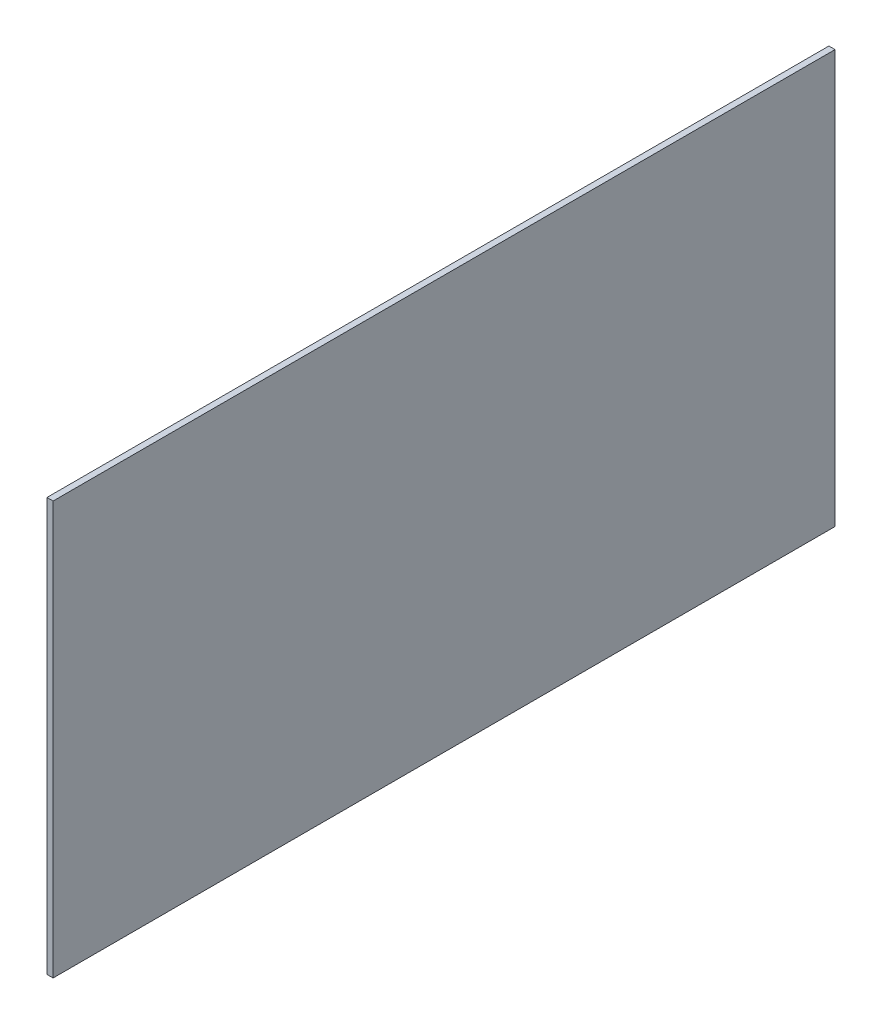
ISO-10303-21;
HEADER;
FILE_DESCRIPTION(('STEP AP214'),'2;1');
FILE_NAME('part.step','',(''),(''),'','','');
FILE_SCHEMA(('AUTOMOTIVE_DESIGN { 1 0 10303 214 1 1 1 1 }'));
ENDSEC;
DATA;
#1=APPLICATION_CONTEXT('core data for automotive mechanical design processes');
#2=APPLICATION_PROTOCOL_DEFINITION('international standard','automotive_design',2000,#1);
#3=PRODUCT_CONTEXT('',#1,'mechanical');
#4=PRODUCT('Part','Part','',(#3));
#5=PRODUCT_RELATED_PRODUCT_CATEGORY('part','',(#4));
#6=PRODUCT_DEFINITION_FORMATION('','',#4);
#7=PRODUCT_DEFINITION_CONTEXT('part definition',#1,'design');
#8=PRODUCT_DEFINITION('design','',#6,#7);
#9=PRODUCT_DEFINITION_SHAPE('','',#8);
#10=(LENGTH_UNIT() NAMED_UNIT(*) SI_UNIT(.MILLI.,.METRE.));
#11=(NAMED_UNIT(*) PLANE_ANGLE_UNIT() SI_UNIT($,.RADIAN.));
#12=(NAMED_UNIT(*) SI_UNIT($,.STERADIAN.) SOLID_ANGLE_UNIT());
#13=UNCERTAINTY_MEASURE_WITH_UNIT(LENGTH_MEASURE(1.E-05),#10,'distance_accuracy_value','');
#14=(GEOMETRIC_REPRESENTATION_CONTEXT(3) GLOBAL_UNCERTAINTY_ASSIGNED_CONTEXT((#13)) GLOBAL_UNIT_ASSIGNED_CONTEXT((#10,
#11,#12)) REPRESENTATION_CONTEXT('',''));
#15=CARTESIAN_POINT('',(0.,0.,0.));
#16=DIRECTION('',(0.,0.,1.));
#17=DIRECTION('',(1.,0.,0.));
#18=AXIS2_PLACEMENT_3D('',#15,#16,#17);
#19=CARTESIAN_POINT('',(-754.231317194732,90.909375740857,128.020467364411));
#20=DIRECTION('',(0.,0.,-1.));
#21=DIRECTION('',(-1.,0.,0.));
#22=AXIS2_PLACEMENT_3D('',#19,#20,#21);
#23=PLANE('',#22);
#24=DIRECTION('',(0.,-1.,0.));
#25=VECTOR('',#24,1.);
#26=CARTESIAN_POINT('',(-755.231317194732,90.909375740857,128.020467364411));
#27=LINE('',#26,#25);
#28=CARTESIAN_POINT('',(-755.231317194732,158.,128.020467364411));
#29=VERTEX_POINT('',#28);
#30=CARTESIAN_POINT('',(-755.231317194732,90.909375740857,128.020467364411));
#31=VERTEX_POINT('',#30);
#32=EDGE_CURVE('E101',#29,#31,#27,.T.);
#33=ORIENTED_EDGE('',*,*,#32,.T.);
#34=DIRECTION('',(-1.,0.,0.));
#35=VECTOR('',#34,1.);
#36=CARTESIAN_POINT('',(-754.231317194732,90.909375740857,128.020467364411));
#37=LINE('',#36,#35);
#38=CARTESIAN_POINT('',(-754.231317194732,90.909375740857,128.020467364411));
#39=VERTEX_POINT('',#38);
#40=EDGE_CURVE('E11',#39,#31,#37,.T.);
#41=ORIENTED_EDGE('',*,*,#40,.F.);
#42=DIRECTION('',(0.,-1.,0.));
#43=VECTOR('',#42,1.);
#44=CARTESIAN_POINT('',(-754.231317194732,90.909375740857,128.020467364411));
#45=LINE('',#44,#43);
#46=CARTESIAN_POINT('',(-754.231317194732,158.,128.020467364411));
#47=VERTEX_POINT('',#46);
#48=EDGE_CURVE('E89',#47,#39,#45,.T.);
#49=ORIENTED_EDGE('',*,*,#48,.F.);
#50=DIRECTION('',(-1.,0.,0.));
#51=VECTOR('',#50,1.);
#52=CARTESIAN_POINT('',(-754.231317194732,158.,128.020467364411));
#53=LINE('',#52,#51);
#54=EDGE_CURVE('E97',#47,#29,#53,.T.);
#55=ORIENTED_EDGE('',*,*,#54,.T.);
#56=EDGE_LOOP('',(#33,#41,#49,#55));
#57=FACE_BOUND('',#56,.T.);
#58=ADVANCED_FACE('F38',(#57),#23,.F.);
#59=CARTESIAN_POINT('',(-754.231317194732,90.909375740857,128.020467364411));
#60=DIRECTION('',(0.,1.,0.));
#61=DIRECTION('',(0.,0.,1.));
#62=AXIS2_PLACEMENT_3D('',#59,#60,#61);
#63=PLANE('',#62);
#64=DIRECTION('',(0.,0.,-1.));
#65=VECTOR('',#64,1.);
#66=CARTESIAN_POINT('',(-755.231317194732,90.909375740857,128.020467364411));
#67=LINE('',#66,#65);
#68=CARTESIAN_POINT('',(-755.231317194732,90.909375740857,1.0204673644113));
#69=VERTEX_POINT('',#68);
#70=EDGE_CURVE('E93',#31,#69,#67,.T.);
#71=ORIENTED_EDGE('',*,*,#70,.T.);
#72=DIRECTION('',(-1.,0.,0.));
#73=VECTOR('',#72,1.);
#74=CARTESIAN_POINT('',(-754.231317194732,90.909375740857,1.0204673644113));
#75=LINE('',#74,#73);
#76=CARTESIAN_POINT('',(-754.231317194732,90.909375740857,1.0204673644113));
#77=VERTEX_POINT('',#76);
#78=EDGE_CURVE('E46',#77,#69,#75,.T.);
#79=ORIENTED_EDGE('',*,*,#78,.F.);
#80=DIRECTION('',(0.,0.,-1.));
#81=VECTOR('',#80,1.);
#82=CARTESIAN_POINT('',(-754.231317194732,90.909375740857,128.020467364411));
#83=LINE('',#82,#81);
#84=EDGE_CURVE('E84',#39,#77,#83,.T.);
#85=ORIENTED_EDGE('',*,*,#84,.F.);
#86=ORIENTED_EDGE('',*,*,#40,.T.);
#87=EDGE_LOOP('',(#71,#79,#85,#86));
#88=FACE_BOUND('',#87,.T.);
#89=ADVANCED_FACE('F92',(#88),#63,.F.);
#90=CARTESIAN_POINT('',(-754.231317194732,90.909375740857,1.0204673644113));
#91=DIRECTION('',(0.,0.,1.));
#92=DIRECTION('',(1.,0.,0.));
#93=AXIS2_PLACEMENT_3D('',#90,#91,#92);
#94=PLANE('',#93);
#95=DIRECTION('',(0.,1.,0.));
#96=VECTOR('',#95,1.);
#97=CARTESIAN_POINT('',(-755.231317194732,90.909375740857,1.0204673644113));
#98=LINE('',#97,#96);
#99=CARTESIAN_POINT('',(-755.231317194732,158.,1.0204673644113));
#100=VERTEX_POINT('',#99);
#101=EDGE_CURVE('E71',#69,#100,#98,.T.);
#102=ORIENTED_EDGE('',*,*,#101,.T.);
#103=DIRECTION('',(-1.,0.,0.));
#104=VECTOR('',#103,1.);
#105=CARTESIAN_POINT('',(-754.231317194732,158.,1.0204673644113));
#106=LINE('',#105,#104);
#107=CARTESIAN_POINT('',(-754.231317194732,158.,1.0204673644113));
#108=VERTEX_POINT('',#107);
#109=EDGE_CURVE('E94',#108,#100,#106,.T.);
#110=ORIENTED_EDGE('',*,*,#109,.F.);
#111=DIRECTION('',(0.,1.,0.));
#112=VECTOR('',#111,1.);
#113=CARTESIAN_POINT('',(-754.231317194732,90.909375740857,1.0204673644113));
#114=LINE('',#113,#112);
#115=EDGE_CURVE('E87',#77,#108,#114,.T.);
#116=ORIENTED_EDGE('',*,*,#115,.F.);
#117=ORIENTED_EDGE('',*,*,#78,.T.);
#118=EDGE_LOOP('',(#102,#110,#116,#117));
#119=FACE_BOUND('',#118,.T.);
#120=ADVANCED_FACE('F95',(#119),#94,.F.);
#121=CARTESIAN_POINT('',(-754.231317194732,158.,128.020467364411));
#122=DIRECTION('',(0.,-1.,0.));
#123=DIRECTION('',(0.,0.,-1.));
#124=AXIS2_PLACEMENT_3D('',#121,#122,#123);
#125=PLANE('',#124);
#126=DIRECTION('',(0.,0.,1.));
#127=VECTOR('',#126,1.);
#128=CARTESIAN_POINT('',(-755.231317194732,158.,128.020467364411));
#129=LINE('',#128,#127);
#130=EDGE_CURVE('E77',#100,#29,#129,.T.);
#131=ORIENTED_EDGE('',*,*,#130,.T.);
#132=ORIENTED_EDGE('',*,*,#54,.F.);
#133=DIRECTION('',(0.,0.,1.));
#134=VECTOR('',#133,1.);
#135=CARTESIAN_POINT('',(-754.231317194732,158.,128.020467364411));
#136=LINE('',#135,#134);
#137=EDGE_CURVE('E54',#108,#47,#136,.T.);
#138=ORIENTED_EDGE('',*,*,#137,.F.);
#139=ORIENTED_EDGE('',*,*,#109,.T.);
#140=EDGE_LOOP('',(#131,#132,#138,#139));
#141=FACE_BOUND('',#140,.T.);
#142=ADVANCED_FACE('F108',(#141),#125,.F.);
#143=CARTESIAN_POINT('',(-754.231317194732,0.,0.));
#144=DIRECTION('',(-1.,0.,0.));
#145=DIRECTION('',(0.,0.,1.));
#146=AXIS2_PLACEMENT_3D('',#143,#144,#145);
#147=PLANE('',#146);
#148=ORIENTED_EDGE('',*,*,#48,.T.);
#149=ORIENTED_EDGE('',*,*,#84,.T.);
#150=ORIENTED_EDGE('',*,*,#115,.T.);
#151=ORIENTED_EDGE('',*,*,#137,.T.);
#152=EDGE_LOOP('',(#148,#149,#150,#151));
#153=FACE_BOUND('',#152,.T.);
#154=ADVANCED_FACE('F85',(#153),#147,.F.);
#155=CARTESIAN_POINT('',(-755.231317194732,0.,0.));
#156=DIRECTION('',(-1.,0.,0.));
#157=DIRECTION('',(0.,0.,1.));
#158=AXIS2_PLACEMENT_3D('',#155,#156,#157);
#159=PLANE('',#158);
#160=ORIENTED_EDGE('',*,*,#32,.F.);
#161=ORIENTED_EDGE('',*,*,#130,.F.);
#162=ORIENTED_EDGE('',*,*,#101,.F.);
#163=ORIENTED_EDGE('',*,*,#70,.F.);
#164=EDGE_LOOP('',(#160,#161,#162,#163));
#165=FACE_BOUND('',#164,.T.);
#166=ADVANCED_FACE('F111',(#165),#159,.T.);
#167=CLOSED_SHELL('',(#58,#89,#120,#142,#154,#166));
#168=MANIFOLD_SOLID_BREP('B2',#167);
#169=ADVANCED_BREP_SHAPE_REPRESENTATION('',(#18,#168),#14);
#170=SHAPE_DEFINITION_REPRESENTATION(#9,#169);
ENDSEC;
END-ISO-10303-21;
